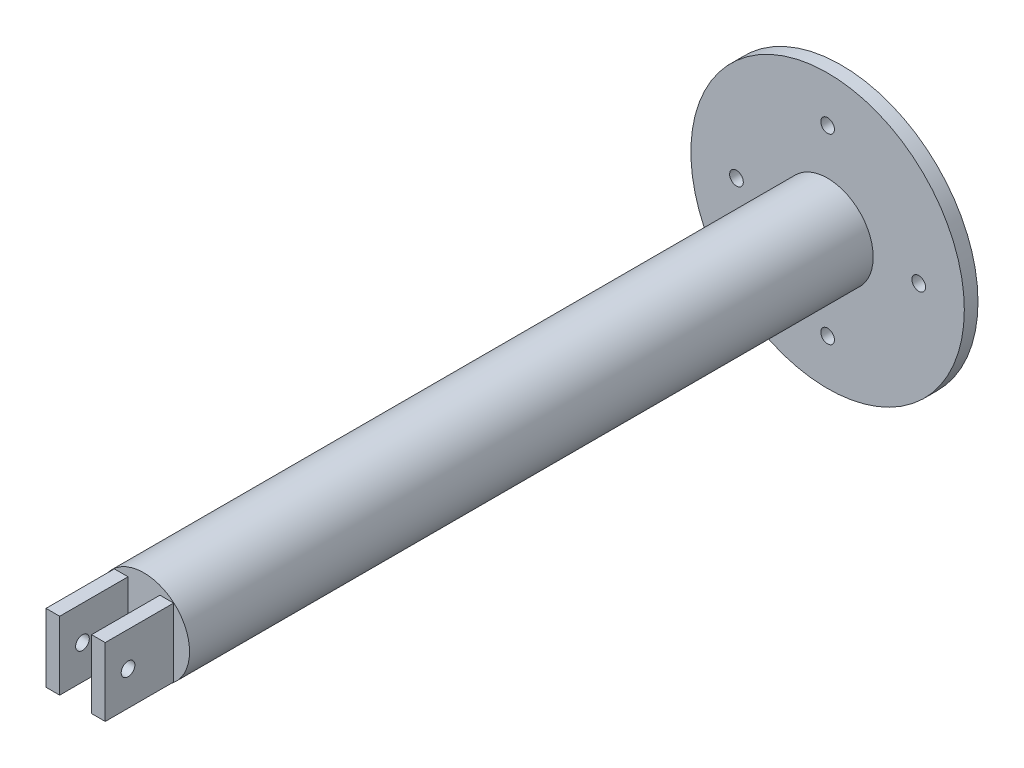
ISO-10303-21;
HEADER;
FILE_DESCRIPTION(('STEP AP214'),'2;1');
FILE_NAME('part.step','',(''),(''),'','','');
FILE_SCHEMA(('AUTOMOTIVE_DESIGN { 1 0 10303 214 1 1 1 1 }'));
ENDSEC;
DATA;
#1=APPLICATION_CONTEXT('core data for automotive mechanical design processes');
#2=APPLICATION_PROTOCOL_DEFINITION('international standard','automotive_design',2000,#1);
#3=PRODUCT_CONTEXT('',#1,'mechanical');
#4=PRODUCT('Part','Part','',(#3));
#5=PRODUCT_RELATED_PRODUCT_CATEGORY('part','',(#4));
#6=PRODUCT_DEFINITION_FORMATION('','',#4);
#7=PRODUCT_DEFINITION_CONTEXT('part definition',#1,'design');
#8=PRODUCT_DEFINITION('design','',#6,#7);
#9=PRODUCT_DEFINITION_SHAPE('','',#8);
#10=(LENGTH_UNIT() NAMED_UNIT(*) SI_UNIT(.MILLI.,.METRE.));
#11=(NAMED_UNIT(*) PLANE_ANGLE_UNIT() SI_UNIT($,.RADIAN.));
#12=(NAMED_UNIT(*) SI_UNIT($,.STERADIAN.) SOLID_ANGLE_UNIT());
#13=UNCERTAINTY_MEASURE_WITH_UNIT(LENGTH_MEASURE(1.E-05),#10,'distance_accuracy_value','');
#14=(GEOMETRIC_REPRESENTATION_CONTEXT(3) GLOBAL_UNCERTAINTY_ASSIGNED_CONTEXT((#13)) GLOBAL_UNIT_ASSIGNED_CONTEXT((#10,
#11,#12)) REPRESENTATION_CONTEXT('',''));
#15=CARTESIAN_POINT('',(0.,0.,0.));
#16=DIRECTION('',(0.,0.,1.));
#17=DIRECTION('',(1.,0.,0.));
#18=AXIS2_PLACEMENT_3D('',#15,#16,#17);
#19=CARTESIAN_POINT('',(0.,0.,153.));
#20=DIRECTION('',(0.,0.,1.));
#21=DIRECTION('',(1.,0.,0.));
#22=AXIS2_PLACEMENT_3D('',#19,#20,#21);
#23=PLANE('',#22);
#24=CARTESIAN_POINT('',(0.,0.,153.));
#25=DIRECTION('',(0.,0.,1.));
#26=DIRECTION('',(1.,0.,0.));
#27=AXIS2_PLACEMENT_3D('',#24,#25,#26);
#28=CIRCLE('',#27,10.);
#29=CARTESIAN_POINT('',(10.,0.,153.));
#30=VERTEX_POINT('',#29);
#31=EDGE_CURVE('E179',#30,#30,#28,.T.);
#32=ORIENTED_EDGE('',*,*,#31,.T.);
#33=EDGE_LOOP('',(#32));
#34=FACE_BOUND('',#33,.T.);
#35=DIRECTION('',(-1.,0.,0.));
#36=VECTOR('',#35,1.);
#37=CARTESIAN_POINT('',(-6.5,7.5,153.));
#38=LINE('',#37,#36);
#39=CARTESIAN_POINT('',(-3.5,7.5,153.));
#40=VERTEX_POINT('',#39);
#41=CARTESIAN_POINT('',(-6.5,7.5,153.));
#42=VERTEX_POINT('',#41);
#43=EDGE_CURVE('E139',#40,#42,#38,.T.);
#44=ORIENTED_EDGE('',*,*,#43,.F.);
#45=DIRECTION('',(0.,1.,0.));
#46=VECTOR('',#45,1.);
#47=CARTESIAN_POINT('',(-3.5,-7.5,153.));
#48=LINE('',#47,#46);
#49=CARTESIAN_POINT('',(-3.5,-7.5,153.));
#50=VERTEX_POINT('',#49);
#51=EDGE_CURVE('E134',#50,#40,#48,.T.);
#52=ORIENTED_EDGE('',*,*,#51,.F.);
#53=DIRECTION('',(1.,0.,0.));
#54=VECTOR('',#53,1.);
#55=CARTESIAN_POINT('',(-6.5,-7.5,153.));
#56=LINE('',#55,#54);
#57=CARTESIAN_POINT('',(-6.5,-7.5,153.));
#58=VERTEX_POINT('',#57);
#59=EDGE_CURVE('E149',#58,#50,#56,.T.);
#60=ORIENTED_EDGE('',*,*,#59,.F.);
#61=DIRECTION('',(0.,-1.,0.));
#62=VECTOR('',#61,1.);
#63=CARTESIAN_POINT('',(-6.5,-7.5,153.));
#64=LINE('',#63,#62);
#65=EDGE_CURVE('E161',#42,#58,#64,.T.);
#66=ORIENTED_EDGE('',*,*,#65,.F.);
#67=EDGE_LOOP('',(#44,#52,#60,#66));
#68=FACE_BOUND('',#67,.T.);
#69=DIRECTION('',(1.,0.,0.));
#70=VECTOR('',#69,1.);
#71=CARTESIAN_POINT('',(6.5,-7.5,153.));
#72=LINE('',#71,#70);
#73=CARTESIAN_POINT('',(3.5,-7.5,153.));
#74=VERTEX_POINT('',#73);
#75=CARTESIAN_POINT('',(6.5,-7.5,153.));
#76=VERTEX_POINT('',#75);
#77=EDGE_CURVE('E440',#74,#76,#72,.T.);
#78=ORIENTED_EDGE('',*,*,#77,.F.);
#79=DIRECTION('',(0.,-1.,0.));
#80=VECTOR('',#79,1.);
#81=CARTESIAN_POINT('',(3.5,-7.5,153.));
#82=LINE('',#81,#80);
#83=CARTESIAN_POINT('',(3.5,7.5,153.));
#84=VERTEX_POINT('',#83);
#85=EDGE_CURVE('E131',#84,#74,#82,.T.);
#86=ORIENTED_EDGE('',*,*,#85,.F.);
#87=DIRECTION('',(-1.,0.,0.));
#88=VECTOR('',#87,1.);
#89=CARTESIAN_POINT('',(6.5,7.5,153.));
#90=LINE('',#89,#88);
#91=CARTESIAN_POINT('',(6.5,7.5,153.));
#92=VERTEX_POINT('',#91);
#93=EDGE_CURVE('E127',#92,#84,#90,.T.);
#94=ORIENTED_EDGE('',*,*,#93,.F.);
#95=DIRECTION('',(0.,1.,0.));
#96=VECTOR('',#95,1.);
#97=CARTESIAN_POINT('',(6.5,-7.5,153.));
#98=LINE('',#97,#96);
#99=EDGE_CURVE('E453',#76,#92,#98,.T.);
#100=ORIENTED_EDGE('',*,*,#99,.F.);
#101=EDGE_LOOP('',(#78,#86,#94,#100));
#102=FACE_BOUND('',#101,.T.);
#103=ADVANCED_FACE('F39',(#34,#68,#102),#23,.T.);
#104=CARTESIAN_POINT('',(0.,0.,3.));
#105=DIRECTION('',(0.,0.,1.));
#106=DIRECTION('',(1.,0.,0.));
#107=AXIS2_PLACEMENT_3D('',#104,#105,#106);
#108=PLANE('',#107);
#109=CARTESIAN_POINT('',(0.,0.,3.));
#110=DIRECTION('',(0.,0.,1.));
#111=DIRECTION('',(1.,0.,0.));
#112=AXIS2_PLACEMENT_3D('',#109,#110,#111);
#113=CIRCLE('',#112,10.);
#114=CARTESIAN_POINT('',(10.,0.,3.));
#115=VERTEX_POINT('',#114);
#116=EDGE_CURVE('E178',#115,#115,#113,.T.);
#117=ORIENTED_EDGE('',*,*,#116,.F.);
#118=EDGE_LOOP('',(#117));
#119=FACE_BOUND('',#118,.T.);
#120=CARTESIAN_POINT('',(20.,0.,3.));
#121=DIRECTION('',(0.,0.,1.));
#122=DIRECTION('',(1.,0.,0.));
#123=AXIS2_PLACEMENT_3D('',#120,#121,#122);
#124=CIRCLE('',#123,1.5);
#125=CARTESIAN_POINT('',(21.5,0.,3.));
#126=VERTEX_POINT('',#125);
#127=EDGE_CURVE('E195',#126,#126,#124,.T.);
#128=ORIENTED_EDGE('',*,*,#127,.F.);
#129=EDGE_LOOP('',(#128));
#130=FACE_BOUND('',#129,.T.);
#131=CARTESIAN_POINT('',(-20.,0.,3.));
#132=DIRECTION('',(0.,0.,1.));
#133=DIRECTION('',(1.,0.,0.));
#134=AXIS2_PLACEMENT_3D('',#131,#132,#133);
#135=CIRCLE('',#134,1.5);
#136=CARTESIAN_POINT('',(-18.5,0.,3.));
#137=VERTEX_POINT('',#136);
#138=EDGE_CURVE('E211',#137,#137,#135,.T.);
#139=ORIENTED_EDGE('',*,*,#138,.F.);
#140=EDGE_LOOP('',(#139));
#141=FACE_BOUND('',#140,.T.);
#142=CARTESIAN_POINT('',(0.,0.,3.));
#143=DIRECTION('',(0.,0.,1.));
#144=DIRECTION('',(1.,0.,0.));
#145=AXIS2_PLACEMENT_3D('',#142,#143,#144);
#146=CIRCLE('',#145,30.);
#147=CARTESIAN_POINT('',(30.,0.,3.));
#148=VERTEX_POINT('',#147);
#149=EDGE_CURVE('E11',#148,#148,#146,.T.);
#150=ORIENTED_EDGE('',*,*,#149,.T.);
#151=EDGE_LOOP('',(#150));
#152=FACE_BOUND('',#151,.T.);
#153=CARTESIAN_POINT('',(0.,-20.,3.));
#154=DIRECTION('',(0.,0.,1.));
#155=DIRECTION('',(1.,0.,0.));
#156=AXIS2_PLACEMENT_3D('',#153,#154,#155);
#157=CIRCLE('',#156,1.5);
#158=CARTESIAN_POINT('',(1.5,-20.,3.));
#159=VERTEX_POINT('',#158);
#160=EDGE_CURVE('E203',#159,#159,#157,.T.);
#161=ORIENTED_EDGE('',*,*,#160,.F.);
#162=EDGE_LOOP('',(#161));
#163=FACE_BOUND('',#162,.T.);
#164=CARTESIAN_POINT('',(0.,20.,3.));
#165=DIRECTION('',(0.,0.,1.));
#166=DIRECTION('',(1.,0.,0.));
#167=AXIS2_PLACEMENT_3D('',#164,#165,#166);
#168=CIRCLE('',#167,1.5);
#169=CARTESIAN_POINT('',(1.5,20.,3.));
#170=VERTEX_POINT('',#169);
#171=EDGE_CURVE('E187',#170,#170,#168,.T.);
#172=ORIENTED_EDGE('',*,*,#171,.F.);
#173=EDGE_LOOP('',(#172));
#174=FACE_BOUND('',#173,.T.);
#175=ADVANCED_FACE('F237',(#119,#130,#141,#152,#163,#174),#108,.T.);
#176=CARTESIAN_POINT('',(0.,0.,0.));
#177=DIRECTION('',(0.,0.,1.));
#178=DIRECTION('',(1.,0.,0.));
#179=AXIS2_PLACEMENT_3D('',#176,#177,#178);
#180=PLANE('',#179);
#181=CARTESIAN_POINT('',(0.,0.,0.));
#182=DIRECTION('',(0.,0.,1.));
#183=DIRECTION('',(1.,0.,0.));
#184=AXIS2_PLACEMENT_3D('',#181,#182,#183);
#185=CIRCLE('',#184,30.);
#186=CARTESIAN_POINT('',(30.,0.,0.));
#187=VERTEX_POINT('',#186);
#188=EDGE_CURVE('E43',#187,#187,#185,.T.);
#189=ORIENTED_EDGE('',*,*,#188,.F.);
#190=EDGE_LOOP('',(#189));
#191=FACE_BOUND('',#190,.T.);
#192=CARTESIAN_POINT('',(-20.,0.,0.));
#193=DIRECTION('',(0.,0.,1.));
#194=DIRECTION('',(1.,0.,0.));
#195=AXIS2_PLACEMENT_3D('',#192,#193,#194);
#196=CIRCLE('',#195,1.5);
#197=CARTESIAN_POINT('',(-18.5,0.,0.));
#198=VERTEX_POINT('',#197);
#199=EDGE_CURVE('E207',#198,#198,#196,.T.);
#200=ORIENTED_EDGE('',*,*,#199,.T.);
#201=EDGE_LOOP('',(#200));
#202=FACE_BOUND('',#201,.T.);
#203=CARTESIAN_POINT('',(0.,-20.,0.));
#204=DIRECTION('',(0.,0.,1.));
#205=DIRECTION('',(1.,0.,0.));
#206=AXIS2_PLACEMENT_3D('',#203,#204,#205);
#207=CIRCLE('',#206,1.5);
#208=CARTESIAN_POINT('',(1.5,-20.,0.));
#209=VERTEX_POINT('',#208);
#210=EDGE_CURVE('E199',#209,#209,#207,.T.);
#211=ORIENTED_EDGE('',*,*,#210,.T.);
#212=EDGE_LOOP('',(#211));
#213=FACE_BOUND('',#212,.T.);
#214=CARTESIAN_POINT('',(20.,0.,0.));
#215=DIRECTION('',(0.,0.,1.));
#216=DIRECTION('',(1.,0.,0.));
#217=AXIS2_PLACEMENT_3D('',#214,#215,#216);
#218=CIRCLE('',#217,1.5);
#219=CARTESIAN_POINT('',(21.5,0.,0.));
#220=VERTEX_POINT('',#219);
#221=EDGE_CURVE('E191',#220,#220,#218,.T.);
#222=ORIENTED_EDGE('',*,*,#221,.T.);
#223=EDGE_LOOP('',(#222));
#224=FACE_BOUND('',#223,.T.);
#225=CARTESIAN_POINT('',(0.,20.,0.));
#226=DIRECTION('',(0.,0.,1.));
#227=DIRECTION('',(1.,0.,0.));
#228=AXIS2_PLACEMENT_3D('',#225,#226,#227);
#229=CIRCLE('',#228,1.5);
#230=CARTESIAN_POINT('',(1.5,20.,0.));
#231=VERTEX_POINT('',#230);
#232=EDGE_CURVE('E183',#231,#231,#229,.T.);
#233=ORIENTED_EDGE('',*,*,#232,.T.);
#234=EDGE_LOOP('',(#233));
#235=FACE_BOUND('',#234,.T.);
#236=ADVANCED_FACE('F219',(#191,#202,#213,#224,#235),#180,.F.);
#237=CARTESIAN_POINT('',(0.,0.,3.));
#238=DIRECTION('',(0.,0.,-1.));
#239=DIRECTION('',(-1.,0.,0.));
#240=AXIS2_PLACEMENT_3D('',#237,#238,#239);
#241=CYLINDRICAL_SURFACE('',#240,30.);
#242=ORIENTED_EDGE('',*,*,#149,.F.);
#243=EDGE_LOOP('',(#242));
#244=FACE_BOUND('',#243,.T.);
#245=ORIENTED_EDGE('',*,*,#188,.T.);
#246=EDGE_LOOP('',(#245));
#247=FACE_BOUND('',#246,.T.);
#248=ADVANCED_FACE('F41',(#244,#247),#241,.T.);
#249=CARTESIAN_POINT('',(-20.,0.,3.));
#250=DIRECTION('',(0.,0.,-1.));
#251=DIRECTION('',(-1.,0.,0.));
#252=AXIS2_PLACEMENT_3D('',#249,#250,#251);
#253=CYLINDRICAL_SURFACE('',#252,1.5);
#254=ORIENTED_EDGE('',*,*,#138,.T.);
#255=EDGE_LOOP('',(#254));
#256=FACE_BOUND('',#255,.T.);
#257=ORIENTED_EDGE('',*,*,#199,.F.);
#258=EDGE_LOOP('',(#257));
#259=FACE_BOUND('',#258,.T.);
#260=ADVANCED_FACE('F222',(#256,#259),#253,.F.);
#261=CARTESIAN_POINT('',(0.,-20.,3.));
#262=DIRECTION('',(0.,0.,-1.));
#263=DIRECTION('',(-1.,0.,0.));
#264=AXIS2_PLACEMENT_3D('',#261,#262,#263);
#265=CYLINDRICAL_SURFACE('',#264,1.5);
#266=ORIENTED_EDGE('',*,*,#160,.T.);
#267=EDGE_LOOP('',(#266));
#268=FACE_BOUND('',#267,.T.);
#269=ORIENTED_EDGE('',*,*,#210,.F.);
#270=EDGE_LOOP('',(#269));
#271=FACE_BOUND('',#270,.T.);
#272=ADVANCED_FACE('F224',(#268,#271),#265,.F.);
#273=CARTESIAN_POINT('',(20.,0.,3.));
#274=DIRECTION('',(0.,0.,-1.));
#275=DIRECTION('',(-1.,0.,0.));
#276=AXIS2_PLACEMENT_3D('',#273,#274,#275);
#277=CYLINDRICAL_SURFACE('',#276,1.5);
#278=ORIENTED_EDGE('',*,*,#127,.T.);
#279=EDGE_LOOP('',(#278));
#280=FACE_BOUND('',#279,.T.);
#281=ORIENTED_EDGE('',*,*,#221,.F.);
#282=EDGE_LOOP('',(#281));
#283=FACE_BOUND('',#282,.T.);
#284=ADVANCED_FACE('F231',(#280,#283),#277,.F.);
#285=CARTESIAN_POINT('',(0.,20.,3.));
#286=DIRECTION('',(0.,0.,-1.));
#287=DIRECTION('',(-1.,0.,0.));
#288=AXIS2_PLACEMENT_3D('',#285,#286,#287);
#289=CYLINDRICAL_SURFACE('',#288,1.5);
#290=ORIENTED_EDGE('',*,*,#171,.T.);
#291=EDGE_LOOP('',(#290));
#292=FACE_BOUND('',#291,.T.);
#293=ORIENTED_EDGE('',*,*,#232,.F.);
#294=EDGE_LOOP('',(#293));
#295=FACE_BOUND('',#294,.T.);
#296=ADVANCED_FACE('F252',(#292,#295),#289,.F.);
#297=CARTESIAN_POINT('',(0.,0.,153.));
#298=DIRECTION('',(0.,0.,-1.));
#299=DIRECTION('',(-1.,0.,0.));
#300=AXIS2_PLACEMENT_3D('',#297,#298,#299);
#301=CYLINDRICAL_SURFACE('',#300,10.);
#302=ORIENTED_EDGE('',*,*,#31,.F.);
#303=EDGE_LOOP('',(#302));
#304=FACE_BOUND('',#303,.T.);
#305=ORIENTED_EDGE('',*,*,#116,.T.);
#306=EDGE_LOOP('',(#305));
#307=FACE_BOUND('',#306,.T.);
#308=ADVANCED_FACE('F249',(#304,#307),#301,.T.);
#309=CARTESIAN_POINT('',(-3.5,-7.5,168.));
#310=DIRECTION('',(-1.,0.,0.));
#311=DIRECTION('',(0.,0.,1.));
#312=AXIS2_PLACEMENT_3D('',#309,#310,#311);
#313=PLANE('',#312);
#314=CARTESIAN_POINT('',(-3.5,0.,163.));
#315=DIRECTION('',(-1.,0.,0.));
#316=DIRECTION('',(0.,0.,1.));
#317=AXIS2_PLACEMENT_3D('',#314,#315,#316);
#318=CIRCLE('',#317,1.5);
#319=CARTESIAN_POINT('',(-3.5,0.,164.5));
#320=VERTEX_POINT('',#319);
#321=EDGE_CURVE('E435',#320,#320,#318,.T.);
#322=ORIENTED_EDGE('',*,*,#321,.T.);
#323=EDGE_LOOP('',(#322));
#324=FACE_BOUND('',#323,.T.);
#325=ORIENTED_EDGE('',*,*,#51,.T.);
#326=DIRECTION('',(0.,0.,-1.));
#327=VECTOR('',#326,1.);
#328=CARTESIAN_POINT('',(-3.5,7.5,168.));
#329=LINE('',#328,#327);
#330=CARTESIAN_POINT('',(-3.5,7.5,168.));
#331=VERTEX_POINT('',#330);
#332=EDGE_CURVE('E175',#331,#40,#329,.T.);
#333=ORIENTED_EDGE('',*,*,#332,.F.);
#334=DIRECTION('',(0.,1.,0.));
#335=VECTOR('',#334,1.);
#336=CARTESIAN_POINT('',(-3.5,-7.5,168.));
#337=LINE('',#336,#335);
#338=CARTESIAN_POINT('',(-3.5,-7.5,168.));
#339=VERTEX_POINT('',#338);
#340=EDGE_CURVE('E144',#339,#331,#337,.T.);
#341=ORIENTED_EDGE('',*,*,#340,.F.);
#342=DIRECTION('',(0.,0.,-1.));
#343=VECTOR('',#342,1.);
#344=CARTESIAN_POINT('',(-3.5,-7.5,168.));
#345=LINE('',#344,#343);
#346=EDGE_CURVE('E157',#339,#50,#345,.T.);
#347=ORIENTED_EDGE('',*,*,#346,.T.);
#348=EDGE_LOOP('',(#325,#333,#341,#347));
#349=FACE_BOUND('',#348,.T.);
#350=ADVANCED_FACE('F247',(#324,#349),#313,.F.);
#351=CARTESIAN_POINT('',(-6.5,7.5,168.));
#352=DIRECTION('',(0.,-1.,0.));
#353=DIRECTION('',(0.,0.,-1.));
#354=AXIS2_PLACEMENT_3D('',#351,#352,#353);
#355=PLANE('',#354);
#356=ORIENTED_EDGE('',*,*,#43,.T.);
#357=DIRECTION('',(0.,0.,-1.));
#358=VECTOR('',#357,1.);
#359=CARTESIAN_POINT('',(-6.5,7.5,168.));
#360=LINE('',#359,#358);
#361=CARTESIAN_POINT('',(-6.5,7.5,168.));
#362=VERTEX_POINT('',#361);
#363=EDGE_CURVE('E171',#362,#42,#360,.T.);
#364=ORIENTED_EDGE('',*,*,#363,.F.);
#365=DIRECTION('',(-1.,0.,0.));
#366=VECTOR('',#365,1.);
#367=CARTESIAN_POINT('',(-6.5,7.5,168.));
#368=LINE('',#367,#366);
#369=EDGE_CURVE('E148',#331,#362,#368,.T.);
#370=ORIENTED_EDGE('',*,*,#369,.F.);
#371=ORIENTED_EDGE('',*,*,#332,.T.);
#372=EDGE_LOOP('',(#356,#364,#370,#371));
#373=FACE_BOUND('',#372,.T.);
#374=ADVANCED_FACE('F323',(#373),#355,.F.);
#375=CARTESIAN_POINT('',(-6.5,-7.5,168.));
#376=DIRECTION('',(1.,0.,0.));
#377=DIRECTION('',(0.,0.,-1.));
#378=AXIS2_PLACEMENT_3D('',#375,#376,#377);
#379=PLANE('',#378);
#380=CARTESIAN_POINT('',(-6.5,0.,163.));
#381=DIRECTION('',(1.,0.,0.));
#382=DIRECTION('',(0.,0.,-1.));
#383=AXIS2_PLACEMENT_3D('',#380,#381,#382);
#384=CIRCLE('',#383,1.5);
#385=CARTESIAN_POINT('',(-6.5,0.,161.5));
#386=VERTEX_POINT('',#385);
#387=EDGE_CURVE('E432',#386,#386,#384,.T.);
#388=ORIENTED_EDGE('',*,*,#387,.T.);
#389=EDGE_LOOP('',(#388));
#390=FACE_BOUND('',#389,.T.);
#391=ORIENTED_EDGE('',*,*,#65,.T.);
#392=DIRECTION('',(0.,0.,-1.));
#393=VECTOR('',#392,1.);
#394=CARTESIAN_POINT('',(-6.5,-7.5,168.));
#395=LINE('',#394,#393);
#396=CARTESIAN_POINT('',(-6.5,-7.5,168.));
#397=VERTEX_POINT('',#396);
#398=EDGE_CURVE('E63',#397,#58,#395,.T.);
#399=ORIENTED_EDGE('',*,*,#398,.F.);
#400=DIRECTION('',(0.,-1.,0.));
#401=VECTOR('',#400,1.);
#402=CARTESIAN_POINT('',(-6.5,-7.5,168.));
#403=LINE('',#402,#401);
#404=EDGE_CURVE('E152',#362,#397,#403,.T.);
#405=ORIENTED_EDGE('',*,*,#404,.F.);
#406=ORIENTED_EDGE('',*,*,#363,.T.);
#407=EDGE_LOOP('',(#391,#399,#405,#406));
#408=FACE_BOUND('',#407,.T.);
#409=ADVANCED_FACE('F328',(#390,#408),#379,.F.);
#410=CARTESIAN_POINT('',(-6.5,-7.5,168.));
#411=DIRECTION('',(0.,1.,0.));
#412=DIRECTION('',(0.,0.,1.));
#413=AXIS2_PLACEMENT_3D('',#410,#411,#412);
#414=PLANE('',#413);
#415=ORIENTED_EDGE('',*,*,#59,.T.);
#416=ORIENTED_EDGE('',*,*,#346,.F.);
#417=DIRECTION('',(1.,0.,0.));
#418=VECTOR('',#417,1.);
#419=CARTESIAN_POINT('',(-6.5,-7.5,168.));
#420=LINE('',#419,#418);
#421=EDGE_CURVE('E155',#397,#339,#420,.T.);
#422=ORIENTED_EDGE('',*,*,#421,.F.);
#423=ORIENTED_EDGE('',*,*,#398,.T.);
#424=EDGE_LOOP('',(#415,#416,#422,#423));
#425=FACE_BOUND('',#424,.T.);
#426=ADVANCED_FACE('F335',(#425),#414,.F.);
#427=CARTESIAN_POINT('',(0.,0.,168.));
#428=DIRECTION('',(0.,0.,-1.));
#429=DIRECTION('',(-1.,0.,0.));
#430=AXIS2_PLACEMENT_3D('',#427,#428,#429);
#431=PLANE('',#430);
#432=ORIENTED_EDGE('',*,*,#340,.T.);
#433=ORIENTED_EDGE('',*,*,#369,.T.);
#434=ORIENTED_EDGE('',*,*,#404,.T.);
#435=ORIENTED_EDGE('',*,*,#421,.T.);
#436=EDGE_LOOP('',(#432,#433,#434,#435));
#437=FACE_BOUND('',#436,.T.);
#438=ADVANCED_FACE('F340',(#437),#431,.F.);
#439=CARTESIAN_POINT('',(3.5,-7.5,168.));
#440=DIRECTION('',(1.,0.,0.));
#441=DIRECTION('',(0.,0.,-1.));
#442=AXIS2_PLACEMENT_3D('',#439,#440,#441);
#443=PLANE('',#442);
#444=CARTESIAN_POINT('',(3.5,0.,163.));
#445=DIRECTION('',(1.,0.,0.));
#446=DIRECTION('',(0.,0.,-1.));
#447=AXIS2_PLACEMENT_3D('',#444,#445,#446);
#448=CIRCLE('',#447,1.5);
#449=CARTESIAN_POINT('',(3.5,0.,161.5));
#450=VERTEX_POINT('',#449);
#451=EDGE_CURVE('E442',#450,#450,#448,.T.);
#452=ORIENTED_EDGE('',*,*,#451,.T.);
#453=EDGE_LOOP('',(#452));
#454=FACE_BOUND('',#453,.T.);
#455=ORIENTED_EDGE('',*,*,#85,.T.);
#456=DIRECTION('',(0.,0.,-1.));
#457=VECTOR('',#456,1.);
#458=CARTESIAN_POINT('',(3.5,-7.5,168.));
#459=LINE('',#458,#457);
#460=CARTESIAN_POINT('',(3.5,-7.5,168.));
#461=VERTEX_POINT('',#460);
#462=EDGE_CURVE('E110',#461,#74,#459,.T.);
#463=ORIENTED_EDGE('',*,*,#462,.F.);
#464=DIRECTION('',(0.,-1.,0.));
#465=VECTOR('',#464,1.);
#466=CARTESIAN_POINT('',(3.5,-7.5,168.));
#467=LINE('',#466,#465);
#468=CARTESIAN_POINT('',(3.5,7.5,168.));
#469=VERTEX_POINT('',#468);
#470=EDGE_CURVE('E118',#469,#461,#467,.T.);
#471=ORIENTED_EDGE('',*,*,#470,.F.);
#472=DIRECTION('',(0.,0.,-1.));
#473=VECTOR('',#472,1.);
#474=CARTESIAN_POINT('',(3.5,7.5,168.));
#475=LINE('',#474,#473);
#476=EDGE_CURVE('E449',#469,#84,#475,.T.);
#477=ORIENTED_EDGE('',*,*,#476,.T.);
#478=EDGE_LOOP('',(#455,#463,#471,#477));
#479=FACE_BOUND('',#478,.T.);
#480=ADVANCED_FACE('F129',(#454,#479),#443,.F.);
#481=CARTESIAN_POINT('',(6.5,-7.5,168.));
#482=DIRECTION('',(0.,1.,0.));
#483=DIRECTION('',(0.,0.,1.));
#484=AXIS2_PLACEMENT_3D('',#481,#482,#483);
#485=PLANE('',#484);
#486=ORIENTED_EDGE('',*,*,#77,.T.);
#487=DIRECTION('',(0.,0.,-1.));
#488=VECTOR('',#487,1.);
#489=CARTESIAN_POINT('',(6.5,-7.5,168.));
#490=LINE('',#489,#488);
#491=CARTESIAN_POINT('',(6.5,-7.5,168.));
#492=VERTEX_POINT('',#491);
#493=EDGE_CURVE('E113',#492,#76,#490,.T.);
#494=ORIENTED_EDGE('',*,*,#493,.F.);
#495=DIRECTION('',(1.,0.,0.));
#496=VECTOR('',#495,1.);
#497=CARTESIAN_POINT('',(6.5,-7.5,168.));
#498=LINE('',#497,#496);
#499=EDGE_CURVE('E106',#461,#492,#498,.T.);
#500=ORIENTED_EDGE('',*,*,#499,.F.);
#501=ORIENTED_EDGE('',*,*,#462,.T.);
#502=EDGE_LOOP('',(#486,#494,#500,#501));
#503=FACE_BOUND('',#502,.T.);
#504=ADVANCED_FACE('F108',(#503),#485,.F.);
#505=CARTESIAN_POINT('',(6.5,-7.5,168.));
#506=DIRECTION('',(-1.,0.,0.));
#507=DIRECTION('',(0.,0.,1.));
#508=AXIS2_PLACEMENT_3D('',#505,#506,#507);
#509=PLANE('',#508);
#510=CARTESIAN_POINT('',(6.5,0.,163.));
#511=DIRECTION('',(1.,0.,0.));
#512=DIRECTION('',(0.,0.,-1.));
#513=AXIS2_PLACEMENT_3D('',#510,#511,#512);
#514=CIRCLE('',#513,1.5);
#515=CARTESIAN_POINT('',(6.5,0.,161.5));
#516=VERTEX_POINT('',#515);
#517=EDGE_CURVE('E467',#516,#516,#514,.T.);
#518=ORIENTED_EDGE('',*,*,#517,.F.);
#519=EDGE_LOOP('',(#518));
#520=FACE_BOUND('',#519,.T.);
#521=ORIENTED_EDGE('',*,*,#99,.T.);
#522=DIRECTION('',(0.,0.,-1.));
#523=VECTOR('',#522,1.);
#524=CARTESIAN_POINT('',(6.5,7.5,168.));
#525=LINE('',#524,#523);
#526=CARTESIAN_POINT('',(6.5,7.5,168.));
#527=VERTEX_POINT('',#526);
#528=EDGE_CURVE('E55',#527,#92,#525,.T.);
#529=ORIENTED_EDGE('',*,*,#528,.F.);
#530=DIRECTION('',(0.,1.,0.));
#531=VECTOR('',#530,1.);
#532=CARTESIAN_POINT('',(6.5,-7.5,168.));
#533=LINE('',#532,#531);
#534=EDGE_CURVE('E117',#492,#527,#533,.T.);
#535=ORIENTED_EDGE('',*,*,#534,.F.);
#536=ORIENTED_EDGE('',*,*,#493,.T.);
#537=EDGE_LOOP('',(#521,#529,#535,#536));
#538=FACE_BOUND('',#537,.T.);
#539=ADVANCED_FACE('F360',(#520,#538),#509,.F.);
#540=CARTESIAN_POINT('',(6.5,7.5,168.));
#541=DIRECTION('',(0.,-1.,0.));
#542=DIRECTION('',(0.,0.,-1.));
#543=AXIS2_PLACEMENT_3D('',#540,#541,#542);
#544=PLANE('',#543);
#545=ORIENTED_EDGE('',*,*,#93,.T.);
#546=ORIENTED_EDGE('',*,*,#476,.F.);
#547=DIRECTION('',(-1.,0.,0.));
#548=VECTOR('',#547,1.);
#549=CARTESIAN_POINT('',(6.5,7.5,168.));
#550=LINE('',#549,#548);
#551=EDGE_CURVE('E122',#527,#469,#550,.T.);
#552=ORIENTED_EDGE('',*,*,#551,.F.);
#553=ORIENTED_EDGE('',*,*,#528,.T.);
#554=EDGE_LOOP('',(#545,#546,#552,#553));
#555=FACE_BOUND('',#554,.T.);
#556=ADVANCED_FACE('F367',(#555),#544,.F.);
#557=CARTESIAN_POINT('',(0.,0.,168.));
#558=DIRECTION('',(0.,0.,1.));
#559=DIRECTION('',(1.,0.,0.));
#560=AXIS2_PLACEMENT_3D('',#557,#558,#559);
#561=PLANE('',#560);
#562=ORIENTED_EDGE('',*,*,#470,.T.);
#563=ORIENTED_EDGE('',*,*,#499,.T.);
#564=ORIENTED_EDGE('',*,*,#534,.T.);
#565=ORIENTED_EDGE('',*,*,#551,.T.);
#566=EDGE_LOOP('',(#562,#563,#564,#565));
#567=FACE_BOUND('',#566,.T.);
#568=ADVANCED_FACE('F121',(#567),#561,.T.);
#569=CARTESIAN_POINT('',(-30.,0.,163.));
#570=DIRECTION('',(1.,0.,0.));
#571=DIRECTION('',(0.,0.,-1.));
#572=AXIS2_PLACEMENT_3D('',#569,#570,#571);
#573=CYLINDRICAL_SURFACE('',#572,1.5);
#574=ORIENTED_EDGE('',*,*,#517,.T.);
#575=EDGE_LOOP('',(#574));
#576=FACE_BOUND('',#575,.T.);
#577=ORIENTED_EDGE('',*,*,#451,.F.);
#578=EDGE_LOOP('',(#577));
#579=FACE_BOUND('',#578,.T.);
#580=ADVANCED_FACE('F380',(#576,#579),#573,.F.);
#581=ORIENTED_EDGE('',*,*,#387,.F.);
#582=EDGE_LOOP('',(#581));
#583=FACE_BOUND('',#582,.T.);
#584=ORIENTED_EDGE('',*,*,#321,.F.);
#585=EDGE_LOOP('',(#584));
#586=FACE_BOUND('',#585,.T.);
#587=ADVANCED_FACE('F416',(#583,#586),#573,.F.);
#588=CLOSED_SHELL('',(#103,#175,#236,#248,#260,#272,#284,#296,#308,#350,#374,#409,#426,#438,
#480,#504,#539,#556,#568,#580,#587));
#589=MANIFOLD_SOLID_BREP('B2',#588);
#590=ADVANCED_BREP_SHAPE_REPRESENTATION('',(#18,#589),#14);
#591=SHAPE_DEFINITION_REPRESENTATION(#9,#590);
ENDSEC;
END-ISO-10303-21;
